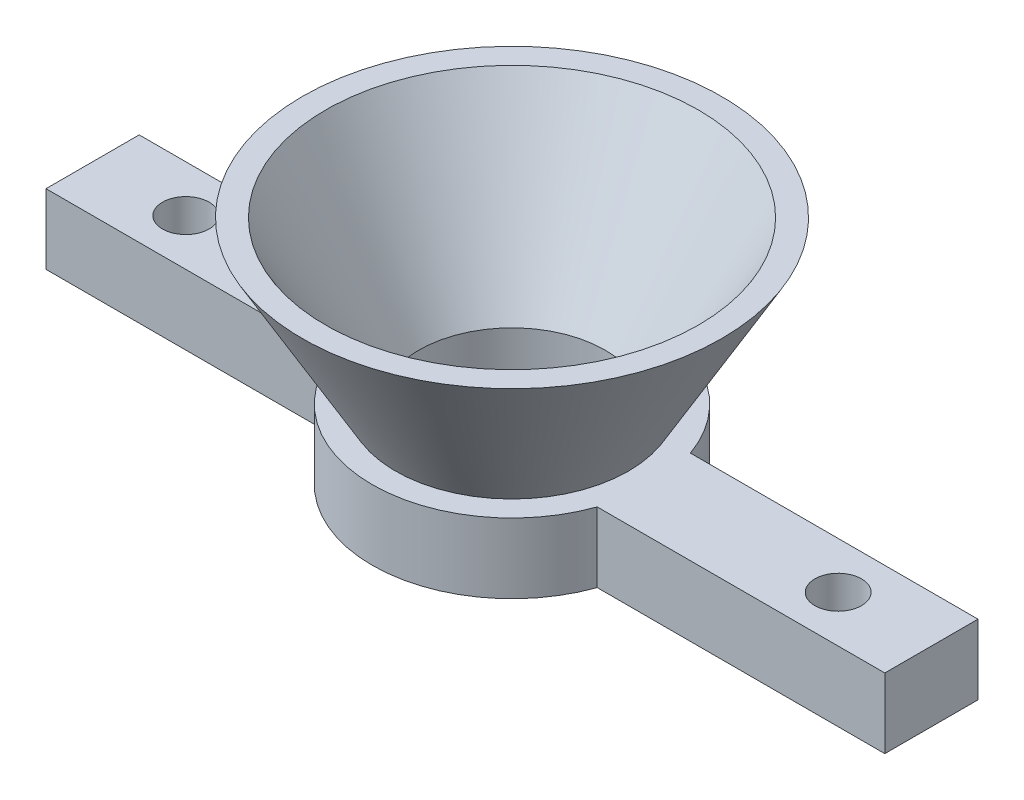
ISO-10303-21;
HEADER;
FILE_DESCRIPTION(('STEP AP214'),'2;1');
FILE_NAME('part.step','',(''),(''),'','','');
FILE_SCHEMA(('AUTOMOTIVE_DESIGN { 1 0 10303 214 1 1 1 1 }'));
ENDSEC;
DATA;
#1=APPLICATION_CONTEXT('core data for automotive mechanical design processes');
#2=APPLICATION_PROTOCOL_DEFINITION('international standard','automotive_design',2000,#1);
#3=PRODUCT_CONTEXT('',#1,'mechanical');
#4=PRODUCT('Part','Part','',(#3));
#5=PRODUCT_RELATED_PRODUCT_CATEGORY('part','',(#4));
#6=PRODUCT_DEFINITION_FORMATION('','',#4);
#7=PRODUCT_DEFINITION_CONTEXT('part definition',#1,'design');
#8=PRODUCT_DEFINITION('design','',#6,#7);
#9=PRODUCT_DEFINITION_SHAPE('','',#8);
#10=(LENGTH_UNIT() NAMED_UNIT(*) SI_UNIT(.MILLI.,.METRE.));
#11=(NAMED_UNIT(*) PLANE_ANGLE_UNIT() SI_UNIT($,.RADIAN.));
#12=(NAMED_UNIT(*) SI_UNIT($,.STERADIAN.) SOLID_ANGLE_UNIT());
#13=UNCERTAINTY_MEASURE_WITH_UNIT(LENGTH_MEASURE(1.E-05),#10,'distance_accuracy_value','');
#14=(GEOMETRIC_REPRESENTATION_CONTEXT(3) GLOBAL_UNCERTAINTY_ASSIGNED_CONTEXT((#13)) GLOBAL_UNIT_ASSIGNED_CONTEXT((#10,
#11,#12)) REPRESENTATION_CONTEXT('',''));
#15=CARTESIAN_POINT('',(0.,0.,0.));
#16=DIRECTION('',(0.,0.,1.));
#17=DIRECTION('',(1.,0.,0.));
#18=AXIS2_PLACEMENT_3D('',#15,#16,#17);
#19=CARTESIAN_POINT('',(0.,1.190625,0.));
#20=DIRECTION('',(0.,1.,0.));
#21=DIRECTION('',(0.,0.,1.));
#22=AXIS2_PLACEMENT_3D('',#19,#20,#21);
#23=PLANE('',#22);
#24=CARTESIAN_POINT('',(11.1125,1.190625,0.));
#25=DIRECTION('',(0.,1.,0.));
#26=DIRECTION('',(0.,0.,1.));
#27=AXIS2_PLACEMENT_3D('',#24,#25,#26);
#28=CIRCLE('',#27,0.793749999999999);
#29=CARTESIAN_POINT('',(11.1125,1.190625,-0.793749999999999));
#30=VERTEX_POINT('',#29);
#31=EDGE_CURVE('E196',#30,#30,#28,.T.);
#32=ORIENTED_EDGE('',*,*,#31,.F.);
#33=EDGE_LOOP('',(#32));
#34=FACE_BOUND('',#33,.T.);
#35=CARTESIAN_POINT('',(-11.1125,1.190625,0.));
#36=DIRECTION('',(0.,1.,0.));
#37=DIRECTION('',(0.,0.,1.));
#38=AXIS2_PLACEMENT_3D('',#35,#36,#37);
#39=CIRCLE('',#38,0.793749999999999);
#40=CARTESIAN_POINT('',(-11.1125,1.190625,-0.793749999999999));
#41=VERTEX_POINT('',#40);
#42=EDGE_CURVE('E243',#41,#41,#39,.T.);
#43=ORIENTED_EDGE('',*,*,#42,.F.);
#44=EDGE_LOOP('',(#43));
#45=FACE_BOUND('',#44,.T.);
#46=CARTESIAN_POINT('',(0.,1.190625,0.));
#47=DIRECTION('',(0.,1.,0.));
#48=DIRECTION('',(0.,0.,1.));
#49=AXIS2_PLACEMENT_3D('',#46,#47,#48);
#50=CIRCLE('',#49,4.7625);
#51=CARTESIAN_POINT('',(4.49012806053458,1.190625,-1.5875));
#52=VERTEX_POINT('',#51);
#53=CARTESIAN_POINT('',(-4.49012806053458,1.190625,-1.5875));
#54=VERTEX_POINT('',#53);
#55=EDGE_CURVE('E172',#52,#54,#50,.T.);
#56=ORIENTED_EDGE('',*,*,#55,.T.);
#57=DIRECTION('',(1.,0.,0.));
#58=VECTOR('',#57,1.);
#59=CARTESIAN_POINT('',(0.,1.190625,-1.5875));
#60=LINE('',#59,#58);
#61=CARTESIAN_POINT('',(-14.2875,1.190625,-1.5875));
#62=VERTEX_POINT('',#61);
#63=EDGE_CURVE('E186',#62,#54,#60,.T.);
#64=ORIENTED_EDGE('',*,*,#63,.F.);
#65=DIRECTION('',(0.,0.,-1.));
#66=VECTOR('',#65,1.);
#67=CARTESIAN_POINT('',(-14.2875,1.190625,0.));
#68=LINE('',#67,#66);
#69=CARTESIAN_POINT('',(-14.2875,1.190625,1.5875));
#70=VERTEX_POINT('',#69);
#71=EDGE_CURVE('E193',#70,#62,#68,.T.);
#72=ORIENTED_EDGE('',*,*,#71,.F.);
#73=DIRECTION('',(1.,0.,0.));
#74=VECTOR('',#73,1.);
#75=CARTESIAN_POINT('',(0.,1.190625,1.5875));
#76=LINE('',#75,#74);
#77=CARTESIAN_POINT('',(-4.49012806053458,1.190625,1.5875));
#78=VERTEX_POINT('',#77);
#79=EDGE_CURVE('E286',#70,#78,#76,.T.);
#80=ORIENTED_EDGE('',*,*,#79,.T.);
#81=CARTESIAN_POINT('',(0.,1.190625,0.));
#82=DIRECTION('',(0.,1.,0.));
#83=DIRECTION('',(0.,0.,1.));
#84=AXIS2_PLACEMENT_3D('',#81,#82,#83);
#85=CIRCLE('',#84,4.7625);
#86=CARTESIAN_POINT('',(4.49012806053458,1.190625,1.5875));
#87=VERTEX_POINT('',#86);
#88=EDGE_CURVE('E281',#78,#87,#85,.T.);
#89=ORIENTED_EDGE('',*,*,#88,.T.);
#90=DIRECTION('',(1.,0.,0.));
#91=VECTOR('',#90,1.);
#92=CARTESIAN_POINT('',(0.,1.190625,1.5875));
#93=LINE('',#92,#91);
#94=CARTESIAN_POINT('',(14.2875,1.190625,1.5875));
#95=VERTEX_POINT('',#94);
#96=EDGE_CURVE('E262',#87,#95,#93,.T.);
#97=ORIENTED_EDGE('',*,*,#96,.T.);
#98=DIRECTION('',(0.,0.,-1.));
#99=VECTOR('',#98,1.);
#100=CARTESIAN_POINT('',(14.2875,1.190625,0.));
#101=LINE('',#100,#99);
#102=CARTESIAN_POINT('',(14.2875,1.190625,-1.5875));
#103=VERTEX_POINT('',#102);
#104=EDGE_CURVE('E276',#95,#103,#101,.T.);
#105=ORIENTED_EDGE('',*,*,#104,.T.);
#106=DIRECTION('',(1.,0.,0.));
#107=VECTOR('',#106,1.);
#108=CARTESIAN_POINT('',(0.,1.190625,-1.5875));
#109=LINE('',#108,#107);
#110=EDGE_CURVE('E188',#52,#103,#109,.T.);
#111=ORIENTED_EDGE('',*,*,#110,.F.);
#112=EDGE_LOOP('',(#56,#64,#72,#80,#89,#97,#105,#111));
#113=FACE_BOUND('',#112,.T.);
#114=CARTESIAN_POINT('',(0.,1.190625,0.));
#115=DIRECTION('',(0.,-1.,0.));
#116=DIRECTION('',(1.,0.,0.));
#117=AXIS2_PLACEMENT_3D('',#114,#115,#116);
#118=CIRCLE('',#117,3.96875);
#119=CARTESIAN_POINT('',(3.96874999999999,1.19062500000001,0.));
#120=VERTEX_POINT('',#119);
#121=EDGE_CURVE('E208',#120,#120,#118,.T.);
#122=ORIENTED_EDGE('',*,*,#121,.T.);
#123=EDGE_LOOP('',(#122));
#124=FACE_BOUND('',#123,.T.);
#125=ADVANCED_FACE('F101',(#34,#45,#113,#124),#23,.T.);
#126=CARTESIAN_POINT('',(0.,1.190625,0.));
#127=DIRECTION('',(0.,-1.,0.));
#128=DIRECTION('',(0.,0.,-1.));
#129=AXIS2_PLACEMENT_3D('',#126,#127,#128);
#130=CYLINDRICAL_SURFACE('',#129,3.175);
#131=CARTESIAN_POINT('',(0.,1.190625,0.));
#132=DIRECTION('',(0.,-1.,0.));
#133=DIRECTION('',(1.,0.,0.));
#134=AXIS2_PLACEMENT_3D('',#131,#132,#133);
#135=CIRCLE('',#134,3.175);
#136=CARTESIAN_POINT('',(0.,1.190625,-3.175));
#137=VERTEX_POINT('',#136);
#138=EDGE_CURVE('E304',#137,#137,#135,.T.);
#139=CARTESIAN_POINT('',(0.,-1.190625,0.));
#140=DIRECTION('',(0.,1.,0.));
#141=DIRECTION('',(0.,0.,1.));
#142=AXIS2_PLACEMENT_3D('',#139,#140,#141);
#143=CIRCLE('',#142,3.175);
#144=CARTESIAN_POINT('',(0.,-1.190625,-3.175));
#145=VERTEX_POINT('',#144);
#146=EDGE_CURVE('E203',#145,#145,#143,.T.);
#147=CARTESIAN_POINT('',(0.,1.190625,-3.175));
#148=CARTESIAN_POINT('',(0.,1.1658203125,-3.175));
#149=CARTESIAN_POINT('',(0.,1.141015625,-3.175));
#150=CARTESIAN_POINT('',(0.,1.09140625,-3.175));
#151=CARTESIAN_POINT('',(0.,1.0666015625,-3.175));
#152=CARTESIAN_POINT('',(0.,1.0169921875,-3.175));
#153=CARTESIAN_POINT('',(0.,0.992187500000001,-3.175));
#154=CARTESIAN_POINT('',(0.,0.942578125000001,-3.175));
#155=CARTESIAN_POINT('',(0.,0.917773437500001,-3.175));
#156=CARTESIAN_POINT('',(0.,0.868164062500001,-3.175));
#157=CARTESIAN_POINT('',(0.,0.843359375000001,-3.175));
#158=CARTESIAN_POINT('',(0.,0.793750000000001,-3.175));
#159=CARTESIAN_POINT('',(0.,0.768945312500001,-3.175));
#160=CARTESIAN_POINT('',(0.,0.719335937500001,-3.175));
#161=CARTESIAN_POINT('',(0.,0.694531250000001,-3.175));
#162=CARTESIAN_POINT('',(0.,0.644921875000001,-3.175));
#163=CARTESIAN_POINT('',(0.,0.620117187500001,-3.175));
#164=CARTESIAN_POINT('',(0.,0.570507812500001,-3.175));
#165=CARTESIAN_POINT('',(0.,0.545703125000001,-3.175));
#166=CARTESIAN_POINT('',(0.,0.496093750000001,-3.175));
#167=CARTESIAN_POINT('',(0.,0.471289062500001,-3.175));
#168=CARTESIAN_POINT('',(0.,0.4216796875,-3.175));
#169=CARTESIAN_POINT('',(0.,0.396875,-3.175));
#170=CARTESIAN_POINT('',(0.,0.347265625,-3.175));
#171=CARTESIAN_POINT('',(0.,0.3224609375,-3.175));
#172=CARTESIAN_POINT('',(0.,0.2728515625,-3.175));
#173=CARTESIAN_POINT('',(0.,0.248046875,-3.175));
#174=CARTESIAN_POINT('',(0.,0.1984375,-3.175));
#175=CARTESIAN_POINT('',(0.,0.1736328125,-3.175));
#176=CARTESIAN_POINT('',(0.,0.124023437500001,-3.175));
#177=CARTESIAN_POINT('',(0.,0.0992187500000005,-3.175));
#178=CARTESIAN_POINT('',(0.,0.0496093750000005,-3.175));
#179=CARTESIAN_POINT('',(0.,0.0248046875000004,-3.175));
#180=CARTESIAN_POINT('',(0.,-0.0248046874999996,-3.175));
#181=CARTESIAN_POINT('',(0.,-0.0496093749999996,-3.175));
#182=CARTESIAN_POINT('',(0.,-0.0992187499999996,-3.175));
#183=CARTESIAN_POINT('',(0.,-0.1240234375,-3.175));
#184=CARTESIAN_POINT('',(0.,-0.1736328125,-3.175));
#185=CARTESIAN_POINT('',(0.,-0.1984375,-3.175));
#186=CARTESIAN_POINT('',(0.,-0.248046875,-3.175));
#187=CARTESIAN_POINT('',(0.,-0.2728515625,-3.175));
#188=CARTESIAN_POINT('',(0.,-0.3224609375,-3.175));
#189=CARTESIAN_POINT('',(0.,-0.347265625,-3.175));
#190=CARTESIAN_POINT('',(0.,-0.396875,-3.175));
#191=CARTESIAN_POINT('',(0.,-0.4216796875,-3.175));
#192=CARTESIAN_POINT('',(0.,-0.4712890625,-3.175));
#193=CARTESIAN_POINT('',(0.,-0.49609375,-3.175));
#194=CARTESIAN_POINT('',(0.,-0.545703125,-3.175));
#195=CARTESIAN_POINT('',(0.,-0.5705078125,-3.175));
#196=CARTESIAN_POINT('',(0.,-0.6201171875,-3.175));
#197=CARTESIAN_POINT('',(0.,-0.644921875,-3.175));
#198=CARTESIAN_POINT('',(0.,-0.69453125,-3.175));
#199=CARTESIAN_POINT('',(0.,-0.7193359375,-3.175));
#200=CARTESIAN_POINT('',(0.,-0.7689453125,-3.175));
#201=CARTESIAN_POINT('',(0.,-0.79375,-3.175));
#202=CARTESIAN_POINT('',(0.,-0.843359375,-3.175));
#203=CARTESIAN_POINT('',(0.,-0.8681640625,-3.175));
#204=CARTESIAN_POINT('',(0.,-0.9177734375,-3.175));
#205=CARTESIAN_POINT('',(0.,-0.942578125,-3.175));
#206=CARTESIAN_POINT('',(0.,-0.9921875,-3.175));
#207=CARTESIAN_POINT('',(0.,-1.0169921875,-3.175));
#208=CARTESIAN_POINT('',(0.,-1.0666015625,-3.175));
#209=CARTESIAN_POINT('',(0.,-1.09140625,-3.175));
#210=CARTESIAN_POINT('',(0.,-1.141015625,-3.175));
#211=CARTESIAN_POINT('',(0.,-1.1658203125,-3.175));
#212=CARTESIAN_POINT('',(0.,-1.190625,-3.175));
#213=B_SPLINE_CURVE_WITH_KNOTS('',3,(#147,#148,#149,#150,#151,#152,#153,#154,#155,#156,#157,
#158,#159,#160,#161,#162,#163,#164,#165,#166,#167,#168,#169,#170,#171,#172,#173,#174,#175,#176,
#177,#178,#179,#180,#181,#182,#183,#184,#185,#186,#187,#188,#189,#190,#191,#192,#193,#194,#195,
#196,#197,#198,#199,#200,#201,#202,#203,#204,#205,#206,#207,#208,#209,#210,#211,#212),
.UNSPECIFIED.,.F.,.F.,(4,2,2,2,2,2,2,2,2,2,2,2,2,2,2,2,2,2,2,2,2,2,2,2,2,2,2,2,2,2,2,2,4),(0.,
0.0744140625,0.148828125,0.2232421875,0.29765625,0.3720703125,0.446484375,0.5208984375,
0.5953125,0.6697265625,0.744140625,0.8185546875,0.892968750000001,0.967382812500001,1.041796875,
1.1162109375,1.190625,1.2650390625,1.339453125,1.4138671875,1.48828125,1.5626953125,1.637109375,
1.7115234375,1.7859375,1.8603515625,1.934765625,2.0091796875,2.08359375,2.1580078125,
2.232421875,2.3068359375,2.38125),.UNSPECIFIED.);
#214=EDGE_CURVE('BSEAM103',#137,#145,#213,.T.);
#215=ORIENTED_EDGE('',*,*,#138,.F.);
#216=ORIENTED_EDGE('',*,*,#146,.F.);
#217=ORIENTED_EDGE('',*,*,#214,.T.);
#218=ORIENTED_EDGE('',*,*,#214,.F.);
#219=EDGE_LOOP('',(#215,#217,#216,#218));
#220=FACE_BOUND('',#219,.T.);
#221=ADVANCED_FACE('F103',(#220),#130,.F.);
#222=CARTESIAN_POINT('',(0.,-1.190625,0.));
#223=DIRECTION('',(0.,1.,0.));
#224=DIRECTION('',(0.,0.,1.));
#225=AXIS2_PLACEMENT_3D('',#222,#223,#224);
#226=PLANE('',#225);
#227=ORIENTED_EDGE('',*,*,#146,.T.);
#228=EDGE_LOOP('',(#227));
#229=FACE_BOUND('',#228,.T.);
#230=CARTESIAN_POINT('',(0.,-1.190625,0.));
#231=DIRECTION('',(0.,1.,0.));
#232=DIRECTION('',(0.,0.,1.));
#233=AXIS2_PLACEMENT_3D('',#230,#231,#232);
#234=CIRCLE('',#233,4.7625);
#235=CARTESIAN_POINT('',(-4.49012806053458,-1.190625,1.5875));
#236=VERTEX_POINT('',#235);
#237=CARTESIAN_POINT('',(4.49012806053458,-1.190625,1.5875));
#238=VERTEX_POINT('',#237);
#239=EDGE_CURVE('E215',#236,#238,#234,.T.);
#240=ORIENTED_EDGE('',*,*,#239,.F.);
#241=DIRECTION('',(1.,0.,0.));
#242=VECTOR('',#241,1.);
#243=CARTESIAN_POINT('',(0.,-1.190625,1.5875));
#244=LINE('',#243,#242);
#245=CARTESIAN_POINT('',(-14.2875,-1.190625,1.5875));
#246=VERTEX_POINT('',#245);
#247=EDGE_CURVE('E212',#246,#236,#244,.T.);
#248=ORIENTED_EDGE('',*,*,#247,.F.);
#249=DIRECTION('',(0.,0.,-1.));
#250=VECTOR('',#249,1.);
#251=CARTESIAN_POINT('',(-14.2875,-1.190625,0.));
#252=LINE('',#251,#250);
#253=CARTESIAN_POINT('',(-14.2875,-1.190625,-1.5875));
#254=VERTEX_POINT('',#253);
#255=EDGE_CURVE('E235',#246,#254,#252,.T.);
#256=ORIENTED_EDGE('',*,*,#255,.T.);
#257=DIRECTION('',(1.,0.,0.));
#258=VECTOR('',#257,1.);
#259=CARTESIAN_POINT('',(0.,-1.190625,-1.5875));
#260=LINE('',#259,#258);
#261=CARTESIAN_POINT('',(-4.49012806053458,-1.190625,-1.5875));
#262=VERTEX_POINT('',#261);
#263=EDGE_CURVE('E232',#254,#262,#260,.T.);
#264=ORIENTED_EDGE('',*,*,#263,.T.);
#265=CARTESIAN_POINT('',(0.,-1.190625,0.));
#266=DIRECTION('',(0.,1.,0.));
#267=DIRECTION('',(0.,0.,1.));
#268=AXIS2_PLACEMENT_3D('',#265,#266,#267);
#269=CIRCLE('',#268,4.7625);
#270=CARTESIAN_POINT('',(4.49012806053458,-1.190625,-1.5875));
#271=VERTEX_POINT('',#270);
#272=EDGE_CURVE('E175',#271,#262,#269,.T.);
#273=ORIENTED_EDGE('',*,*,#272,.F.);
#274=DIRECTION('',(1.,0.,0.));
#275=VECTOR('',#274,1.);
#276=CARTESIAN_POINT('',(0.,-1.190625,-1.5875));
#277=LINE('',#276,#275);
#278=CARTESIAN_POINT('',(14.2875,-1.190625,-1.5875));
#279=VERTEX_POINT('',#278);
#280=EDGE_CURVE('E226',#271,#279,#277,.T.);
#281=ORIENTED_EDGE('',*,*,#280,.T.);
#282=DIRECTION('',(0.,0.,-1.));
#283=VECTOR('',#282,1.);
#284=CARTESIAN_POINT('',(14.2875,-1.190625,0.));
#285=LINE('',#284,#283);
#286=CARTESIAN_POINT('',(14.2875,-1.190625,1.5875));
#287=VERTEX_POINT('',#286);
#288=EDGE_CURVE('E222',#287,#279,#285,.T.);
#289=ORIENTED_EDGE('',*,*,#288,.F.);
#290=DIRECTION('',(1.,0.,0.));
#291=VECTOR('',#290,1.);
#292=CARTESIAN_POINT('',(0.,-1.190625,1.5875));
#293=LINE('',#292,#291);
#294=EDGE_CURVE('E219',#238,#287,#293,.T.);
#295=ORIENTED_EDGE('',*,*,#294,.F.);
#296=EDGE_LOOP('',(#240,#248,#256,#264,#273,#281,#289,#295));
#297=FACE_BOUND('',#296,.T.);
#298=CARTESIAN_POINT('',(-11.1125,-1.190625,0.));
#299=DIRECTION('',(0.,1.,0.));
#300=DIRECTION('',(0.,0.,1.));
#301=AXIS2_PLACEMENT_3D('',#298,#299,#300);
#302=CIRCLE('',#301,0.793749999999999);
#303=CARTESIAN_POINT('',(-11.1125,-1.190625,-0.793749999999999));
#304=VERTEX_POINT('',#303);
#305=EDGE_CURVE('E207',#304,#304,#302,.T.);
#306=ORIENTED_EDGE('',*,*,#305,.T.);
#307=EDGE_LOOP('',(#306));
#308=FACE_BOUND('',#307,.T.);
#309=CARTESIAN_POINT('',(11.1125,-1.190625,0.));
#310=DIRECTION('',(0.,1.,0.));
#311=DIRECTION('',(0.,0.,1.));
#312=AXIS2_PLACEMENT_3D('',#309,#310,#311);
#313=CIRCLE('',#312,0.793749999999999);
#314=CARTESIAN_POINT('',(11.1125,-1.190625,-0.793749999999999));
#315=VERTEX_POINT('',#314);
#316=EDGE_CURVE('E239',#315,#315,#313,.T.);
#317=ORIENTED_EDGE('',*,*,#316,.T.);
#318=EDGE_LOOP('',(#317));
#319=FACE_BOUND('',#318,.T.);
#320=ADVANCED_FACE('F269',(#229,#297,#308,#319),#226,.F.);
#321=CARTESIAN_POINT('',(0.,1.190625,0.));
#322=DIRECTION('',(0.,-1.,0.));
#323=DIRECTION('',(0.,0.,-1.));
#324=AXIS2_PLACEMENT_3D('',#321,#322,#323);
#325=CYLINDRICAL_SURFACE('',#324,4.7625);
#326=ORIENTED_EDGE('',*,*,#239,.T.);
#327=DIRECTION('',(0.,-1.,0.));
#328=VECTOR('',#327,1.);
#329=CARTESIAN_POINT('',(4.49012806053458,1.190625,1.5875));
#330=LINE('',#329,#328);
#331=EDGE_CURVE('E111',#87,#238,#330,.T.);
#332=ORIENTED_EDGE('',*,*,#331,.F.);
#333=ORIENTED_EDGE('',*,*,#88,.F.);
#334=DIRECTION('',(0.,-1.,0.));
#335=VECTOR('',#334,1.);
#336=CARTESIAN_POINT('',(-4.49012806053458,1.190625,1.5875));
#337=LINE('',#336,#335);
#338=EDGE_CURVE('E12',#78,#236,#337,.T.);
#339=ORIENTED_EDGE('',*,*,#338,.T.);
#340=EDGE_LOOP('',(#326,#332,#333,#339));
#341=FACE_BOUND('',#340,.T.);
#342=ADVANCED_FACE('F266',(#341),#325,.T.);
#343=CARTESIAN_POINT('',(0.,1.190625,0.));
#344=DIRECTION('',(0.,-1.,0.));
#345=DIRECTION('',(0.,0.,-1.));
#346=AXIS2_PLACEMENT_3D('',#343,#344,#345);
#347=CYLINDRICAL_SURFACE('',#346,4.7625);
#348=ORIENTED_EDGE('',*,*,#272,.T.);
#349=DIRECTION('',(0.,-1.,0.));
#350=VECTOR('',#349,1.);
#351=CARTESIAN_POINT('',(-4.49012806053458,1.190625,-1.5875));
#352=LINE('',#351,#350);
#353=EDGE_CURVE('E169',#54,#262,#352,.T.);
#354=ORIENTED_EDGE('',*,*,#353,.F.);
#355=ORIENTED_EDGE('',*,*,#55,.F.);
#356=DIRECTION('',(0.,-1.,0.));
#357=VECTOR('',#356,1.);
#358=CARTESIAN_POINT('',(4.49012806053458,1.190625,-1.5875));
#359=LINE('',#358,#357);
#360=EDGE_CURVE('E180',#52,#271,#359,.T.);
#361=ORIENTED_EDGE('',*,*,#360,.T.);
#362=EDGE_LOOP('',(#348,#354,#355,#361));
#363=FACE_BOUND('',#362,.T.);
#364=ADVANCED_FACE('F171',(#363),#347,.T.);
#365=CARTESIAN_POINT('',(0.,1.190625,1.5875));
#366=DIRECTION('',(0.,0.,-1.));
#367=DIRECTION('',(-1.,0.,0.));
#368=AXIS2_PLACEMENT_3D('',#365,#366,#367);
#369=PLANE('',#368);
#370=ORIENTED_EDGE('',*,*,#294,.T.);
#371=DIRECTION('',(0.,-1.,0.));
#372=VECTOR('',#371,1.);
#373=CARTESIAN_POINT('',(14.2875,1.190625,1.5875));
#374=LINE('',#373,#372);
#375=EDGE_CURVE('E253',#95,#287,#374,.T.);
#376=ORIENTED_EDGE('',*,*,#375,.F.);
#377=ORIENTED_EDGE('',*,*,#96,.F.);
#378=ORIENTED_EDGE('',*,*,#331,.T.);
#379=EDGE_LOOP('',(#370,#376,#377,#378));
#380=FACE_BOUND('',#379,.T.);
#381=ADVANCED_FACE('F259',(#380),#369,.F.);
#382=CARTESIAN_POINT('',(14.2875,1.190625,0.));
#383=DIRECTION('',(-1.,0.,0.));
#384=DIRECTION('',(0.,0.,1.));
#385=AXIS2_PLACEMENT_3D('',#382,#383,#384);
#386=PLANE('',#385);
#387=ORIENTED_EDGE('',*,*,#288,.T.);
#388=DIRECTION('',(0.,-1.,0.));
#389=VECTOR('',#388,1.);
#390=CARTESIAN_POINT('',(14.2875,1.190625,-1.5875));
#391=LINE('',#390,#389);
#392=EDGE_CURVE('E250',#103,#279,#391,.T.);
#393=ORIENTED_EDGE('',*,*,#392,.F.);
#394=ORIENTED_EDGE('',*,*,#104,.F.);
#395=ORIENTED_EDGE('',*,*,#375,.T.);
#396=EDGE_LOOP('',(#387,#393,#394,#395));
#397=FACE_BOUND('',#396,.T.);
#398=ADVANCED_FACE('F274',(#397),#386,.F.);
#399=CARTESIAN_POINT('',(0.,1.190625,-1.5875));
#400=DIRECTION('',(0.,0.,-1.));
#401=DIRECTION('',(-1.,0.,0.));
#402=AXIS2_PLACEMENT_3D('',#399,#400,#401);
#403=PLANE('',#402);
#404=ORIENTED_EDGE('',*,*,#280,.F.);
#405=ORIENTED_EDGE('',*,*,#360,.F.);
#406=ORIENTED_EDGE('',*,*,#110,.T.);
#407=ORIENTED_EDGE('',*,*,#392,.T.);
#408=EDGE_LOOP('',(#404,#405,#406,#407));
#409=FACE_BOUND('',#408,.T.);
#410=ADVANCED_FACE('F386',(#409),#403,.T.);
#411=CARTESIAN_POINT('',(11.1125,1.190625,0.));
#412=DIRECTION('',(0.,-1.,0.));
#413=DIRECTION('',(0.,0.,-1.));
#414=AXIS2_PLACEMENT_3D('',#411,#412,#413);
#415=CYLINDRICAL_SURFACE('',#414,0.793749999999999);
#416=CARTESIAN_POINT('',(11.1125,1.190625,-0.793749999999999));
#417=CARTESIAN_POINT('',(11.1125,1.1658203125,-0.793749999999999));
#418=CARTESIAN_POINT('',(11.1125,1.141015625,-0.793749999999999));
#419=CARTESIAN_POINT('',(11.1125,1.09140625,-0.793749999999999));
#420=CARTESIAN_POINT('',(11.1125,1.0666015625,-0.793749999999999));
#421=CARTESIAN_POINT('',(11.1125,1.0169921875,-0.793749999999999));
#422=CARTESIAN_POINT('',(11.1125,0.9921875,-0.793749999999999));
#423=CARTESIAN_POINT('',(11.1125,0.942578125,-0.793749999999999));
#424=CARTESIAN_POINT('',(11.1125,0.9177734375,-0.793749999999999));
#425=CARTESIAN_POINT('',(11.1125,0.8681640625,-0.793749999999999));
#426=CARTESIAN_POINT('',(11.1125,0.843359375,-0.793749999999999));
#427=CARTESIAN_POINT('',(11.1125,0.79375,-0.793749999999999));
#428=CARTESIAN_POINT('',(11.1125,0.7689453125,-0.793749999999999));
#429=CARTESIAN_POINT('',(11.1125,0.7193359375,-0.793749999999999));
#430=CARTESIAN_POINT('',(11.1125,0.69453125,-0.793749999999999));
#431=CARTESIAN_POINT('',(11.1125,0.644921875,-0.793749999999999));
#432=CARTESIAN_POINT('',(11.1125,0.6201171875,-0.793749999999999));
#433=CARTESIAN_POINT('',(11.1125,0.5705078125,-0.793749999999999));
#434=CARTESIAN_POINT('',(11.1125,0.545703125,-0.793749999999999));
#435=CARTESIAN_POINT('',(11.1125,0.49609375,-0.793749999999999));
#436=CARTESIAN_POINT('',(11.1125,0.4712890625,-0.793749999999999));
#437=CARTESIAN_POINT('',(11.1125,0.4216796875,-0.793749999999999));
#438=CARTESIAN_POINT('',(11.1125,0.396875,-0.793749999999999));
#439=CARTESIAN_POINT('',(11.1125,0.347265625,-0.793749999999999));
#440=CARTESIAN_POINT('',(11.1125,0.3224609375,-0.793749999999999));
#441=CARTESIAN_POINT('',(11.1125,0.2728515625,-0.793749999999999));
#442=CARTESIAN_POINT('',(11.1125,0.248046875,-0.793749999999999));
#443=CARTESIAN_POINT('',(11.1125,0.1984375,-0.793749999999999));
#444=CARTESIAN_POINT('',(11.1125,0.1736328125,-0.793749999999999));
#445=CARTESIAN_POINT('',(11.1125,0.1240234375,-0.793749999999999));
#446=CARTESIAN_POINT('',(11.1125,0.0992187500000001,-0.793749999999999));
#447=CARTESIAN_POINT('',(11.1125,0.049609375,-0.793749999999999));
#448=CARTESIAN_POINT('',(11.1125,0.0248046875,-0.793749999999999));
#449=CARTESIAN_POINT('',(11.1125,-0.0248046875,-0.793749999999999));
#450=CARTESIAN_POINT('',(11.1125,-0.049609375,-0.793749999999999));
#451=CARTESIAN_POINT('',(11.1125,-0.0992187500000001,-0.793749999999999));
#452=CARTESIAN_POINT('',(11.1125,-0.1240234375,-0.793749999999999));
#453=CARTESIAN_POINT('',(11.1125,-0.1736328125,-0.793749999999999));
#454=CARTESIAN_POINT('',(11.1125,-0.1984375,-0.793749999999999));
#455=CARTESIAN_POINT('',(11.1125,-0.248046875,-0.793749999999999));
#456=CARTESIAN_POINT('',(11.1125,-0.2728515625,-0.793749999999999));
#457=CARTESIAN_POINT('',(11.1125,-0.3224609375,-0.793749999999999));
#458=CARTESIAN_POINT('',(11.1125,-0.347265625,-0.793749999999999));
#459=CARTESIAN_POINT('',(11.1125,-0.396875,-0.793749999999999));
#460=CARTESIAN_POINT('',(11.1125,-0.4216796875,-0.793749999999999));
#461=CARTESIAN_POINT('',(11.1125,-0.4712890625,-0.793749999999999));
#462=CARTESIAN_POINT('',(11.1125,-0.49609375,-0.793749999999999));
#463=CARTESIAN_POINT('',(11.1125,-0.545703125,-0.793749999999999));
#464=CARTESIAN_POINT('',(11.1125,-0.5705078125,-0.793749999999999));
#465=CARTESIAN_POINT('',(11.1125,-0.6201171875,-0.793749999999999));
#466=CARTESIAN_POINT('',(11.1125,-0.644921875,-0.793749999999999));
#467=CARTESIAN_POINT('',(11.1125,-0.69453125,-0.793749999999999));
#468=CARTESIAN_POINT('',(11.1125,-0.7193359375,-0.793749999999999));
#469=CARTESIAN_POINT('',(11.1125,-0.7689453125,-0.793749999999999));
#470=CARTESIAN_POINT('',(11.1125,-0.79375,-0.793749999999999));
#471=CARTESIAN_POINT('',(11.1125,-0.843359375,-0.793749999999999));
#472=CARTESIAN_POINT('',(11.1125,-0.8681640625,-0.793749999999999));
#473=CARTESIAN_POINT('',(11.1125,-0.9177734375,-0.793749999999999));
#474=CARTESIAN_POINT('',(11.1125,-0.942578125,-0.793749999999999));
#475=CARTESIAN_POINT('',(11.1125,-0.9921875,-0.793749999999999));
#476=CARTESIAN_POINT('',(11.1125,-1.0169921875,-0.793749999999999));
#477=CARTESIAN_POINT('',(11.1125,-1.0666015625,-0.793749999999999));
#478=CARTESIAN_POINT('',(11.1125,-1.09140625,-0.793749999999999));
#479=CARTESIAN_POINT('',(11.1125,-1.141015625,-0.793749999999999));
#480=CARTESIAN_POINT('',(11.1125,-1.1658203125,-0.793749999999999));
#481=CARTESIAN_POINT('',(11.1125,-1.190625,-0.793749999999999));
#482=B_SPLINE_CURVE_WITH_KNOTS('',3,(#416,#417,#418,#419,#420,#421,#422,#423,#424,#425,#426,
#427,#428,#429,#430,#431,#432,#433,#434,#435,#436,#437,#438,#439,#440,#441,#442,#443,#444,#445,
#446,#447,#448,#449,#450,#451,#452,#453,#454,#455,#456,#457,#458,#459,#460,#461,#462,#463,#464,
#465,#466,#467,#468,#469,#470,#471,#472,#473,#474,#475,#476,#477,#478,#479,#480,#481),
.UNSPECIFIED.,.F.,.F.,(4,2,2,2,2,2,2,2,2,2,2,2,2,2,2,2,2,2,2,2,2,2,2,2,2,2,2,2,2,2,2,2,4),(0.,
0.0744140625,0.148828125,0.2232421875,0.29765625,0.3720703125,0.446484375,0.5208984375,
0.5953125,0.6697265625,0.744140625,0.8185546875,0.89296875,0.9673828125,1.041796875,
1.1162109375,1.190625,1.2650390625,1.339453125,1.4138671875,1.48828125,1.5626953125,1.637109375,
1.7115234375,1.7859375,1.8603515625,1.934765625,2.0091796875,2.08359375,2.1580078125,
2.232421875,2.3068359375,2.38125),.UNSPECIFIED.);
#483=EDGE_CURVE('BSEAM379',#30,#315,#482,.T.);
#484=ORIENTED_EDGE('',*,*,#31,.T.);
#485=ORIENTED_EDGE('',*,*,#316,.F.);
#486=ORIENTED_EDGE('',*,*,#483,.T.);
#487=ORIENTED_EDGE('',*,*,#483,.F.);
#488=EDGE_LOOP('',(#484,#486,#485,#487));
#489=FACE_BOUND('',#488,.T.);
#490=ADVANCED_FACE('F379',(#489),#415,.F.);
#491=CARTESIAN_POINT('',(0.,1.190625,-1.5875));
#492=DIRECTION('',(0.,0.,-1.));
#493=DIRECTION('',(-1.,0.,0.));
#494=AXIS2_PLACEMENT_3D('',#491,#492,#493);
#495=PLANE('',#494);
#496=ORIENTED_EDGE('',*,*,#263,.F.);
#497=DIRECTION('',(0.,-1.,0.));
#498=VECTOR('',#497,1.);
#499=CARTESIAN_POINT('',(-14.2875,1.190625,-1.5875));
#500=LINE('',#499,#498);
#501=EDGE_CURVE('E144',#62,#254,#500,.T.);
#502=ORIENTED_EDGE('',*,*,#501,.F.);
#503=ORIENTED_EDGE('',*,*,#63,.T.);
#504=ORIENTED_EDGE('',*,*,#353,.T.);
#505=EDGE_LOOP('',(#496,#502,#503,#504));
#506=FACE_BOUND('',#505,.T.);
#507=ADVANCED_FACE('F191',(#506),#495,.T.);
#508=CARTESIAN_POINT('',(-14.2875,1.190625,0.));
#509=DIRECTION('',(-1.,0.,0.));
#510=DIRECTION('',(0.,0.,1.));
#511=AXIS2_PLACEMENT_3D('',#508,#509,#510);
#512=PLANE('',#511);
#513=ORIENTED_EDGE('',*,*,#255,.F.);
#514=DIRECTION('',(0.,-1.,0.));
#515=VECTOR('',#514,1.);
#516=CARTESIAN_POINT('',(-14.2875,1.190625,1.5875));
#517=LINE('',#516,#515);
#518=EDGE_CURVE('E119',#70,#246,#517,.T.);
#519=ORIENTED_EDGE('',*,*,#518,.F.);
#520=ORIENTED_EDGE('',*,*,#71,.T.);
#521=ORIENTED_EDGE('',*,*,#501,.T.);
#522=EDGE_LOOP('',(#513,#519,#520,#521));
#523=FACE_BOUND('',#522,.T.);
#524=ADVANCED_FACE('F366',(#523),#512,.T.);
#525=CARTESIAN_POINT('',(0.,1.190625,1.5875));
#526=DIRECTION('',(0.,0.,-1.));
#527=DIRECTION('',(-1.,0.,0.));
#528=AXIS2_PLACEMENT_3D('',#525,#526,#527);
#529=PLANE('',#528);
#530=ORIENTED_EDGE('',*,*,#247,.T.);
#531=ORIENTED_EDGE('',*,*,#338,.F.);
#532=ORIENTED_EDGE('',*,*,#79,.F.);
#533=ORIENTED_EDGE('',*,*,#518,.T.);
#534=EDGE_LOOP('',(#530,#531,#532,#533));
#535=FACE_BOUND('',#534,.T.);
#536=ADVANCED_FACE('F359',(#535),#529,.F.);
#537=CARTESIAN_POINT('',(-11.1125,1.190625,0.));
#538=DIRECTION('',(0.,-1.,0.));
#539=DIRECTION('',(0.,0.,-1.));
#540=AXIS2_PLACEMENT_3D('',#537,#538,#539);
#541=CYLINDRICAL_SURFACE('',#540,0.793749999999999);
#542=CARTESIAN_POINT('',(-11.1125,1.190625,-0.793749999999999));
#543=CARTESIAN_POINT('',(-11.1125,1.1658203125,-0.793749999999999));
#544=CARTESIAN_POINT('',(-11.1125,1.141015625,-0.793749999999999));
#545=CARTESIAN_POINT('',(-11.1125,1.09140625,-0.793749999999999));
#546=CARTESIAN_POINT('',(-11.1125,1.0666015625,-0.793749999999999));
#547=CARTESIAN_POINT('',(-11.1125,1.0169921875,-0.793749999999999));
#548=CARTESIAN_POINT('',(-11.1125,0.9921875,-0.793749999999999));
#549=CARTESIAN_POINT('',(-11.1125,0.942578125,-0.793749999999999));
#550=CARTESIAN_POINT('',(-11.1125,0.9177734375,-0.793749999999999));
#551=CARTESIAN_POINT('',(-11.1125,0.8681640625,-0.793749999999999));
#552=CARTESIAN_POINT('',(-11.1125,0.843359375,-0.793749999999999));
#553=CARTESIAN_POINT('',(-11.1125,0.79375,-0.793749999999999));
#554=CARTESIAN_POINT('',(-11.1125,0.7689453125,-0.793749999999999));
#555=CARTESIAN_POINT('',(-11.1125,0.7193359375,-0.793749999999999));
#556=CARTESIAN_POINT('',(-11.1125,0.69453125,-0.793749999999999));
#557=CARTESIAN_POINT('',(-11.1125,0.644921875,-0.793749999999999));
#558=CARTESIAN_POINT('',(-11.1125,0.6201171875,-0.793749999999999));
#559=CARTESIAN_POINT('',(-11.1125,0.5705078125,-0.793749999999999));
#560=CARTESIAN_POINT('',(-11.1125,0.545703125,-0.793749999999999));
#561=CARTESIAN_POINT('',(-11.1125,0.49609375,-0.793749999999999));
#562=CARTESIAN_POINT('',(-11.1125,0.4712890625,-0.793749999999999));
#563=CARTESIAN_POINT('',(-11.1125,0.4216796875,-0.793749999999999));
#564=CARTESIAN_POINT('',(-11.1125,0.396875,-0.793749999999999));
#565=CARTESIAN_POINT('',(-11.1125,0.347265625,-0.793749999999999));
#566=CARTESIAN_POINT('',(-11.1125,0.3224609375,-0.793749999999999));
#567=CARTESIAN_POINT('',(-11.1125,0.2728515625,-0.793749999999999));
#568=CARTESIAN_POINT('',(-11.1125,0.248046875,-0.793749999999999));
#569=CARTESIAN_POINT('',(-11.1125,0.1984375,-0.793749999999999));
#570=CARTESIAN_POINT('',(-11.1125,0.1736328125,-0.793749999999999));
#571=CARTESIAN_POINT('',(-11.1125,0.1240234375,-0.793749999999999));
#572=CARTESIAN_POINT('',(-11.1125,0.0992187500000001,-0.793749999999999));
#573=CARTESIAN_POINT('',(-11.1125,0.049609375,-0.793749999999999));
#574=CARTESIAN_POINT('',(-11.1125,0.0248046875,-0.793749999999999));
#575=CARTESIAN_POINT('',(-11.1125,-0.0248046875,-0.793749999999999));
#576=CARTESIAN_POINT('',(-11.1125,-0.049609375,-0.793749999999999));
#577=CARTESIAN_POINT('',(-11.1125,-0.0992187500000001,-0.793749999999999));
#578=CARTESIAN_POINT('',(-11.1125,-0.1240234375,-0.793749999999999));
#579=CARTESIAN_POINT('',(-11.1125,-0.1736328125,-0.793749999999999));
#580=CARTESIAN_POINT('',(-11.1125,-0.1984375,-0.793749999999999));
#581=CARTESIAN_POINT('',(-11.1125,-0.248046875,-0.793749999999999));
#582=CARTESIAN_POINT('',(-11.1125,-0.2728515625,-0.793749999999999));
#583=CARTESIAN_POINT('',(-11.1125,-0.3224609375,-0.793749999999999));
#584=CARTESIAN_POINT('',(-11.1125,-0.347265625,-0.793749999999999));
#585=CARTESIAN_POINT('',(-11.1125,-0.396875,-0.793749999999999));
#586=CARTESIAN_POINT('',(-11.1125,-0.4216796875,-0.793749999999999));
#587=CARTESIAN_POINT('',(-11.1125,-0.4712890625,-0.793749999999999));
#588=CARTESIAN_POINT('',(-11.1125,-0.49609375,-0.793749999999999));
#589=CARTESIAN_POINT('',(-11.1125,-0.545703125,-0.793749999999999));
#590=CARTESIAN_POINT('',(-11.1125,-0.5705078125,-0.793749999999999));
#591=CARTESIAN_POINT('',(-11.1125,-0.6201171875,-0.793749999999999));
#592=CARTESIAN_POINT('',(-11.1125,-0.644921875,-0.793749999999999));
#593=CARTESIAN_POINT('',(-11.1125,-0.69453125,-0.793749999999999));
#594=CARTESIAN_POINT('',(-11.1125,-0.7193359375,-0.793749999999999));
#595=CARTESIAN_POINT('',(-11.1125,-0.7689453125,-0.793749999999999));
#596=CARTESIAN_POINT('',(-11.1125,-0.79375,-0.793749999999999));
#597=CARTESIAN_POINT('',(-11.1125,-0.843359375,-0.793749999999999));
#598=CARTESIAN_POINT('',(-11.1125,-0.8681640625,-0.793749999999999));
#599=CARTESIAN_POINT('',(-11.1125,-0.9177734375,-0.793749999999999));
#600=CARTESIAN_POINT('',(-11.1125,-0.942578125,-0.793749999999999));
#601=CARTESIAN_POINT('',(-11.1125,-0.9921875,-0.793749999999999));
#602=CARTESIAN_POINT('',(-11.1125,-1.0169921875,-0.793749999999999));
#603=CARTESIAN_POINT('',(-11.1125,-1.0666015625,-0.793749999999999));
#604=CARTESIAN_POINT('',(-11.1125,-1.09140625,-0.793749999999999));
#605=CARTESIAN_POINT('',(-11.1125,-1.141015625,-0.793749999999999));
#606=CARTESIAN_POINT('',(-11.1125,-1.1658203125,-0.793749999999999));
#607=CARTESIAN_POINT('',(-11.1125,-1.190625,-0.793749999999999));
#608=B_SPLINE_CURVE_WITH_KNOTS('',3,(#542,#543,#544,#545,#546,#547,#548,#549,#550,#551,#552,
#553,#554,#555,#556,#557,#558,#559,#560,#561,#562,#563,#564,#565,#566,#567,#568,#569,#570,#571,
#572,#573,#574,#575,#576,#577,#578,#579,#580,#581,#582,#583,#584,#585,#586,#587,#588,#589,#590,
#591,#592,#593,#594,#595,#596,#597,#598,#599,#600,#601,#602,#603,#604,#605,#606,#607),
.UNSPECIFIED.,.F.,.F.,(4,2,2,2,2,2,2,2,2,2,2,2,2,2,2,2,2,2,2,2,2,2,2,2,2,2,2,2,2,2,2,2,4),(0.,
0.0744140625,0.148828125,0.2232421875,0.29765625,0.3720703125,0.446484375,0.5208984375,
0.5953125,0.6697265625,0.744140625,0.8185546875,0.89296875,0.9673828125,1.041796875,
1.1162109375,1.190625,1.2650390625,1.339453125,1.4138671875,1.48828125,1.5626953125,1.637109375,
1.7115234375,1.7859375,1.8603515625,1.934765625,2.0091796875,2.08359375,2.1580078125,
2.232421875,2.3068359375,2.38125),.UNSPECIFIED.);
#609=EDGE_CURVE('BSEAM334',#41,#304,#608,.T.);
#610=ORIENTED_EDGE('',*,*,#42,.T.);
#611=ORIENTED_EDGE('',*,*,#305,.F.);
#612=ORIENTED_EDGE('',*,*,#609,.T.);
#613=ORIENTED_EDGE('',*,*,#609,.F.);
#614=EDGE_LOOP('',(#610,#612,#611,#613));
#615=FACE_BOUND('',#614,.T.);
#616=ADVANCED_FACE('F334',(#615),#541,.F.);
#617=CARTESIAN_POINT('',(0.,6.68988631403122,0.));
#618=DIRECTION('',(0.,1.,0.));
#619=DIRECTION('',(-1.,0.,0.));
#620=AXIS2_PLACEMENT_3D('',#617,#618,#619);
#621=CONICAL_SURFACE('',#620,7.14375000000001,0.523598775598297);
#622=ORIENTED_EDGE('',*,*,#121,.F.);
#623=EDGE_LOOP('',(#622));
#624=FACE_BOUND('',#623,.T.);
#625=CARTESIAN_POINT('',(0.,6.68988631403122,0.));
#626=DIRECTION('',(0.,-1.,0.));
#627=DIRECTION('',(1.,0.,0.));
#628=AXIS2_PLACEMENT_3D('',#625,#626,#627);
#629=CIRCLE('',#628,7.14375000000001);
#630=CARTESIAN_POINT('',(7.14374999999998,6.68988631403125,0.));
#631=VERTEX_POINT('',#630);
#632=EDGE_CURVE('E296',#631,#631,#629,.T.);
#633=ORIENTED_EDGE('',*,*,#632,.T.);
#634=EDGE_LOOP('',(#633));
#635=FACE_BOUND('',#634,.T.);
#636=ADVANCED_FACE('F330',(#624,#635),#621,.T.);
#637=CARTESIAN_POINT('',(-6.35000000000003,6.68988631403117,0.));
#638=DIRECTION('',(0.,-1.,0.));
#639=DIRECTION('',(1.,0.,0.));
#640=AXIS2_PLACEMENT_3D('',#637,#638,#639);
#641=PLANE('',#640);
#642=ORIENTED_EDGE('',*,*,#632,.F.);
#643=EDGE_LOOP('',(#642));
#644=FACE_BOUND('',#643,.T.);
#645=CARTESIAN_POINT('',(0.,6.68988631403122,0.));
#646=DIRECTION('',(0.,-1.,0.));
#647=DIRECTION('',(1.,0.,0.));
#648=AXIS2_PLACEMENT_3D('',#645,#646,#647);
#649=CIRCLE('',#648,6.35000000000001);
#650=CARTESIAN_POINT('',(6.34999999999998,6.68988631403125,0.));
#651=VERTEX_POINT('',#650);
#652=EDGE_CURVE('E300',#651,#651,#649,.T.);
#653=ORIENTED_EDGE('',*,*,#652,.T.);
#654=EDGE_LOOP('',(#653));
#655=FACE_BOUND('',#654,.T.);
#656=ADVANCED_FACE('F333',(#644,#655),#641,.F.);
#657=CARTESIAN_POINT('',(0.,1.190625,0.));
#658=DIRECTION('',(0.,1.,0.));
#659=DIRECTION('',(-1.,0.,0.));
#660=AXIS2_PLACEMENT_3D('',#657,#658,#659);
#661=CONICAL_SURFACE('',#660,3.175,0.523598775598297);
#662=ORIENTED_EDGE('',*,*,#652,.F.);
#663=EDGE_LOOP('',(#662));
#664=FACE_BOUND('',#663,.T.);
#665=ORIENTED_EDGE('',*,*,#138,.T.);
#666=EDGE_LOOP('',(#665));
#667=FACE_BOUND('',#666,.T.);
#668=ADVANCED_FACE('F309',(#664,#667),#661,.F.);
#669=CLOSED_SHELL('',(#125,#221,#320,#342,#364,#381,#398,#410,#490,#507,#524,#536,#616,#636,
#656,#668));
#670=MANIFOLD_SOLID_BREP('B2',#669);
#671=ADVANCED_BREP_SHAPE_REPRESENTATION('',(#18,#670),#14);
#672=SHAPE_DEFINITION_REPRESENTATION(#9,#671);
ENDSEC;
END-ISO-10303-21;
